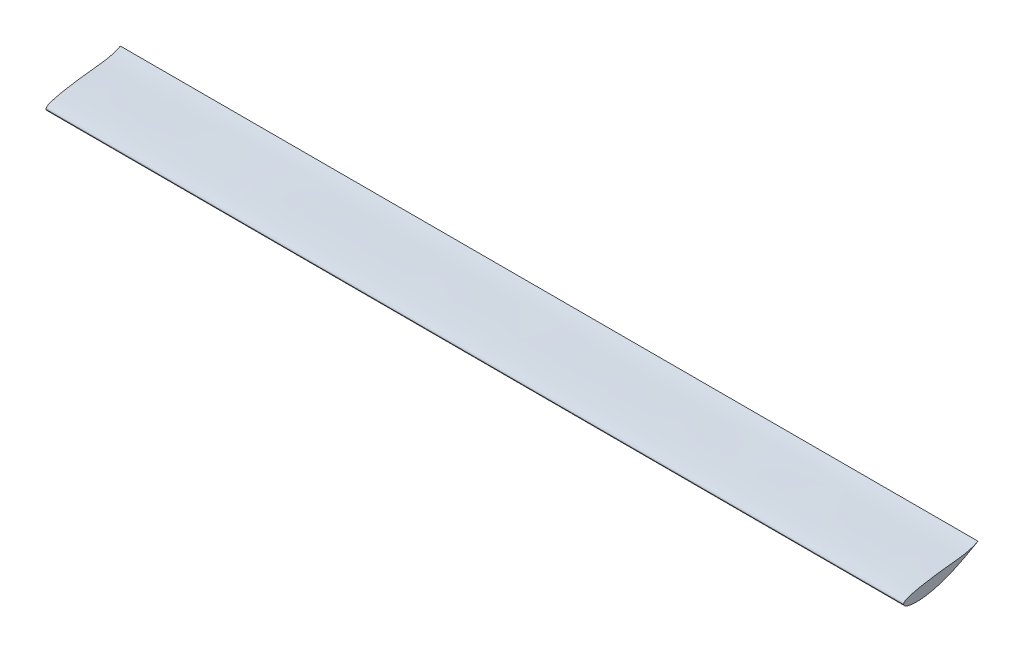
ISO-10303-21;
HEADER;
FILE_DESCRIPTION(('STEP AP214'),'2;1');
FILE_NAME('part.step','',(''),(''),'','','');
FILE_SCHEMA(('AUTOMOTIVE_DESIGN { 1 0 10303 214 1 1 1 1 }'));
ENDSEC;
DATA;
#1=APPLICATION_CONTEXT('core data for automotive mechanical design processes');
#2=APPLICATION_PROTOCOL_DEFINITION('international standard','automotive_design',2000,#1);
#3=PRODUCT_CONTEXT('',#1,'mechanical');
#4=PRODUCT('Part','Part','',(#3));
#5=PRODUCT_RELATED_PRODUCT_CATEGORY('part','',(#4));
#6=PRODUCT_DEFINITION_FORMATION('','',#4);
#7=PRODUCT_DEFINITION_CONTEXT('part definition',#1,'design');
#8=PRODUCT_DEFINITION('design','',#6,#7);
#9=PRODUCT_DEFINITION_SHAPE('','',#8);
#10=(LENGTH_UNIT() NAMED_UNIT(*) SI_UNIT(.MILLI.,.METRE.));
#11=(NAMED_UNIT(*) PLANE_ANGLE_UNIT() SI_UNIT($,.RADIAN.));
#12=(NAMED_UNIT(*) SI_UNIT($,.STERADIAN.) SOLID_ANGLE_UNIT());
#13=UNCERTAINTY_MEASURE_WITH_UNIT(LENGTH_MEASURE(1.E-05),#10,'distance_accuracy_value','');
#14=(GEOMETRIC_REPRESENTATION_CONTEXT(3) GLOBAL_UNCERTAINTY_ASSIGNED_CONTEXT((#13)) GLOBAL_UNIT_ASSIGNED_CONTEXT((#10,
#11,#12)) REPRESENTATION_CONTEXT('',''));
#15=CARTESIAN_POINT('',(0.,0.,0.));
#16=DIRECTION('',(0.,0.,1.));
#17=DIRECTION('',(1.,0.,0.));
#18=AXIS2_PLACEMENT_3D('',#15,#16,#17);
#19=CARTESIAN_POINT('',(997.019750859984,12.4852152858677,-54.9823903122289));
#20=DIRECTION('',(-1.,0.,0.));
#21=DIRECTION('',(0.,0.,1.));
#22=AXIS2_PLACEMENT_3D('',#19,#20,#21);
#23=PLANE('',#22);
#24=CARTESIAN_POINT('',(997.019750859984,11.9268190478152,-10.4315130887669));
#25=CARTESIAN_POINT('',(997.019750859984,10.5307338394074,-10.9579322147792));
#26=CARTESIAN_POINT('',(997.019750859984,9.24548443054793,-12.8740565051285));
#27=CARTESIAN_POINT('',(997.019750859984,8.20882793908812,-15.7758436959106));
#28=CARTESIAN_POINT('',(997.019750859984,7.66358451817288,-18.226405051551));
#29=CARTESIAN_POINT('',(997.019750859984,7.22457301816056,-21.3569103835022));
#30=CARTESIAN_POINT('',(997.019750859984,7.05757379867098,-25.2050058399718));
#31=CARTESIAN_POINT('',(997.019750859984,7.31676609404541,-31.2301436962287));
#32=CARTESIAN_POINT('',(997.019750859984,8.31465271352174,-38.6258596725614));
#33=CARTESIAN_POINT('',(997.019750859984,10.1911582683209,-47.3390895813314));
#34=CARTESIAN_POINT('',(997.019750859984,12.6677105683231,-55.9134271742416));
#35=CARTESIAN_POINT('',(997.019750859984,15.8217306491794,-64.3176852528418));
#36=CARTESIAN_POINT('',(997.019750859984,19.5057001064381,-72.5892101961977));
#37=CARTESIAN_POINT('',(997.019750859984,23.6429894181503,-80.7385293186242));
#38=CARTESIAN_POINT('',(997.019750859984,28.047960913361,-88.825477680895));
#39=CARTESIAN_POINT('',(997.019750859984,31.1248720264375,-94.1623755603246));
#40=CARTESIAN_POINT('',(997.019750859984,32.6242235223829,-96.860765238436));
#41=B_SPLINE_CURVE_WITH_KNOTS('',3,(#24,#25,#26,#27,#28,#29,#30,#31,#32,#33,#34,#35,#36,#37,#38,
#39,#40),.UNSPECIFIED.,.F.,.F.,(4,1,1,1,1,1,1,1,1,1,1,1,1,1,4),(0.,0.0439009675766793,
0.0724931974140234,0.0990463982397024,0.124643035702787,0.174283288293371,0.222881713336981,
0.31883035285832,0.41429919096017,0.509891636581509,0.60612378963281,0.703302686626897,
0.801511361886123,0.900533646948853,1.),.UNSPECIFIED.);
#42=CARTESIAN_POINT('',(997.019750859984,32.6242235223829,-96.860765238436));
#43=VERTEX_POINT('',#42);
#44=CARTESIAN_POINT('',(997.019750859984,11.9268190478152,-10.4315130887669));
#45=VERTEX_POINT('',#44);
#46=EDGE_CURVE('E90',#43,#45,#41,.F.);
#47=ORIENTED_EDGE('',*,*,#46,.F.);
#48=CARTESIAN_POINT('',(997.019750859984,32.6242235223829,-96.860765238436));
#49=CARTESIAN_POINT('',(997.019750859984,31.2114581633454,-94.2053856379407));
#50=CARTESIAN_POINT('',(997.019750859984,29.0114699837971,-88.6325644942649));
#51=CARTESIAN_POINT('',(997.019750859984,27.1158834792333,-79.8656280874714));
#52=CARTESIAN_POINT('',(997.019750859984,26.0393284874119,-71.0088770825528));
#53=CARTESIAN_POINT('',(997.019750859984,25.0904943034276,-62.1224001073808));
#54=CARTESIAN_POINT('',(997.019750859984,24.0154171059973,-53.2503231805116));
#55=CARTESIAN_POINT('',(997.019750859984,22.7915940653448,-44.4104065607168));
#56=CARTESIAN_POINT('',(997.019750859984,21.4557616261526,-35.6010494666442));
#57=CARTESIAN_POINT('',(997.019750859984,20.0615187892568,-28.3147230079671));
#58=CARTESIAN_POINT('',(997.019750859984,18.7379578321159,-22.5357609096181));
#59=CARTESIAN_POINT('',(997.019750859984,17.769530602484,-18.9558463728173));
#60=CARTESIAN_POINT('',(997.019750859984,16.8645361651102,-16.1206237663936));
#61=CARTESIAN_POINT('',(997.019750859984,16.0286010837289,-14.0142766694007));
#62=CARTESIAN_POINT('',(997.019750859984,14.7985784060911,-11.6273946587841));
#63=CARTESIAN_POINT('',(997.019750859984,13.3330792416217,-10.2164295195233));
#64=CARTESIAN_POINT('',(997.019750859984,11.9268190478152,-10.4315130887668));
#65=B_SPLINE_CURVE_WITH_KNOTS('',3,(#48,#49,#50,#51,#52,#53,#54,#55,#56,#57,#58,#59,#60,#61,#62,
#63,#64),.UNSPECIFIED.,.F.,.F.,(4,1,1,1,1,1,1,1,1,1,1,1,1,1,4),(0.,0.0994502667406111,
0.197535442889514,0.296052562977772,0.394806356808814,0.493450979662712,0.591940996969297,
0.690286731259081,0.788438582066012,0.837480949450307,0.886562535047494,0.911178481655704,
0.935996245563337,0.961487145328943,1.),.UNSPECIFIED.);
#66=EDGE_CURVE('E54',#45,#43,#65,.F.);
#67=ORIENTED_EDGE('',*,*,#66,.F.);
#68=EDGE_LOOP('',(#47,#67));
#69=FACE_BOUND('',#68,.T.);
#70=ADVANCED_FACE('F51',(#69),#23,.F.);
#71=CARTESIAN_POINT('',(0.,23.9130453140823,-52.6606146925307));
#72=DIRECTION('',(1.,0.,0.));
#73=DIRECTION('',(0.,0.,-1.));
#74=AXIS2_PLACEMENT_3D('',#71,#72,#73);
#75=PLANE('',#74);
#76=CARTESIAN_POINT('',(0.,32.6242235223829,-96.860765238436));
#77=CARTESIAN_POINT('',(0.,31.2114581633461,-94.205385637942));
#78=CARTESIAN_POINT('',(0.,29.0114699837977,-88.6325644942664));
#79=CARTESIAN_POINT('',(0.,27.1158834792337,-79.8656280874725));
#80=CARTESIAN_POINT('',(0.,26.0393284874124,-71.008877082554));
#81=CARTESIAN_POINT('',(0.,25.090494303428,-62.1224001073821));
#82=CARTESIAN_POINT('',(0.,24.0154171059978,-53.2503231805125));
#83=CARTESIAN_POINT('',(0.,22.7915940653452,-44.4104065607176));
#84=CARTESIAN_POINT('',(0.,21.455761626153,-35.6010494666448));
#85=CARTESIAN_POINT('',(0.,20.0615187892571,-28.3147230079676));
#86=CARTESIAN_POINT('',(0.,18.7379578321163,-22.5357609096185));
#87=CARTESIAN_POINT('',(0.,17.7695306024843,-18.9558463728176));
#88=CARTESIAN_POINT('',(0.,16.8645361651106,-16.120623766394));
#89=CARTESIAN_POINT('',(0.,16.0286010837293,-14.014276669401));
#90=CARTESIAN_POINT('',(0.,14.7985784060914,-11.6273946587844));
#91=CARTESIAN_POINT('',(0.,13.3330792416219,-10.2164295195236));
#92=CARTESIAN_POINT('',(0.,11.9268190478152,-10.4315130887668));
#93=B_SPLINE_CURVE_WITH_KNOTS('',3,(#76,#77,#78,#79,#80,#81,#82,#83,#84,#85,#86,#87,#88,#89,#90,
#91,#92),.UNSPECIFIED.,.F.,.F.,(4,1,1,1,1,1,1,1,1,1,1,1,1,1,4),(0.,0.0994502667406111,
0.197535442889514,0.296052562977772,0.394806356808814,0.493450979662712,0.591940996969297,
0.690286731259081,0.788438582066012,0.837480949450307,0.886562535047494,0.911178481655704,
0.935996245563337,0.961487145328943,1.),.UNSPECIFIED.);
#94=CARTESIAN_POINT('',(0.,32.6242235223829,-96.860765238436));
#95=VERTEX_POINT('',#94);
#96=CARTESIAN_POINT('',(0.,11.9268190478152,-10.4315130887668));
#97=VERTEX_POINT('',#96);
#98=EDGE_CURVE('E12',#95,#97,#93,.T.);
#99=ORIENTED_EDGE('',*,*,#98,.F.);
#100=CARTESIAN_POINT('',(0.,11.9268190478152,-10.4315130887668));
#101=CARTESIAN_POINT('',(0.,10.5307338394076,-10.9579322147794));
#102=CARTESIAN_POINT('',(0.,9.24548443054814,-12.8740565051289));
#103=CARTESIAN_POINT('',(0.,8.20882793908821,-15.775843695911));
#104=CARTESIAN_POINT('',(0.,7.66358451817309,-18.2264050515513));
#105=CARTESIAN_POINT('',(0.,7.22457301816072,-21.3569103835027));
#106=CARTESIAN_POINT('',(0.,7.0575737986711,-25.2050058399724));
#107=CARTESIAN_POINT('',(0.,7.31676609404554,-31.2301436962292));
#108=CARTESIAN_POINT('',(0.,8.31465271352197,-38.6258596725622));
#109=CARTESIAN_POINT('',(0.,10.1911582683211,-47.3390895813322));
#110=CARTESIAN_POINT('',(0.,12.6677105683233,-55.9134271742426));
#111=CARTESIAN_POINT('',(0.,15.8217306491797,-64.3176852528428));
#112=CARTESIAN_POINT('',(0.,19.5057001064384,-72.5892101961988));
#113=CARTESIAN_POINT('',(0.,23.6429894181506,-80.7385293186258));
#114=CARTESIAN_POINT('',(0.,28.0479609133615,-88.8254776808962));
#115=CARTESIAN_POINT('',(0.,31.1248720264378,-94.1623755603261));
#116=CARTESIAN_POINT('',(0.,32.6242235223829,-96.860765238436));
#117=B_SPLINE_CURVE_WITH_KNOTS('',3,(#100,#101,#102,#103,#104,#105,#106,#107,#108,#109,#110,
#111,#112,#113,#114,#115,#116),.UNSPECIFIED.,.F.,.F.,(4,1,1,1,1,1,1,1,1,1,1,1,1,1,4),(0.,
0.0439009675766793,0.0724931974140234,0.0990463982397024,0.124643035702787,0.174283288293371,
0.222881713336981,0.31883035285832,0.41429919096017,0.509891636581509,0.60612378963281,
0.703302686626897,0.801511361886123,0.900533646948853,1.),.UNSPECIFIED.);
#118=EDGE_CURVE('E76',#97,#95,#117,.T.);
#119=ORIENTED_EDGE('',*,*,#118,.F.);
#120=EDGE_LOOP('',(#99,#119));
#121=FACE_BOUND('',#120,.T.);
#122=ADVANCED_FACE('F77',(#121),#75,.F.);
#123=CARTESIAN_POINT('',(0.,32.6242235223829,-96.860765238436));
#124=CARTESIAN_POINT('',(332.339916953328,32.6242235223829,-96.860765238436));
#125=CARTESIAN_POINT('',(664.679833906656,32.6242235223829,-96.860765238436));
#126=CARTESIAN_POINT('',(997.019750859984,32.6242235223829,-96.860765238436));
#127=CARTESIAN_POINT('',(0.,31.2114581633461,-94.205385637942));
#128=CARTESIAN_POINT('',(332.339916953328,31.2114581633459,-94.2053856379415));
#129=CARTESIAN_POINT('',(664.679833906656,31.2114581633456,-94.2053856379411));
#130=CARTESIAN_POINT('',(997.019750859984,31.2114581633454,-94.2053856379407));
#131=CARTESIAN_POINT('',(0.,29.0114699837977,-88.6325644942664));
#132=CARTESIAN_POINT('',(332.339916953328,29.0114699837975,-88.6325644942659));
#133=CARTESIAN_POINT('',(664.679833906656,29.0114699837973,-88.6325644942654));
#134=CARTESIAN_POINT('',(997.019750859984,29.0114699837971,-88.6325644942649));
#135=CARTESIAN_POINT('',(0.,27.1158834792337,-79.8656280874725));
#136=CARTESIAN_POINT('',(332.339916953328,27.1158834792336,-79.8656280874721));
#137=CARTESIAN_POINT('',(664.679833906656,27.1158834792334,-79.8656280874717));
#138=CARTESIAN_POINT('',(997.019750859984,27.1158834792333,-79.8656280874714));
#139=CARTESIAN_POINT('',(0.,26.0393284874124,-71.008877082554));
#140=CARTESIAN_POINT('',(332.339916953328,26.0393284874122,-71.0088770825536));
#141=CARTESIAN_POINT('',(664.679833906656,26.0393284874121,-71.0088770825532));
#142=CARTESIAN_POINT('',(997.019750859984,26.0393284874119,-71.0088770825528));
#143=CARTESIAN_POINT('',(0.,25.090494303428,-62.1224001073821));
#144=CARTESIAN_POINT('',(332.339916953328,25.0904943034279,-62.1224001073816));
#145=CARTESIAN_POINT('',(664.679833906656,25.0904943034278,-62.1224001073812));
#146=CARTESIAN_POINT('',(997.019750859984,25.0904943034276,-62.1224001073808));
#147=CARTESIAN_POINT('',(0.,24.0154171059978,-53.2503231805125));
#148=CARTESIAN_POINT('',(332.339916953328,24.0154171059976,-53.2503231805122));
#149=CARTESIAN_POINT('',(664.679833906656,24.0154171059975,-53.2503231805119));
#150=CARTESIAN_POINT('',(997.019750859984,24.0154171059973,-53.2503231805116));
#151=CARTESIAN_POINT('',(0.,22.7915940653452,-44.4104065607176));
#152=CARTESIAN_POINT('',(332.339916953328,22.7915940653451,-44.4104065607173));
#153=CARTESIAN_POINT('',(664.679833906656,22.7915940653449,-44.410406560717));
#154=CARTESIAN_POINT('',(997.019750859984,22.7915940653448,-44.4104065607168));
#155=CARTESIAN_POINT('',(0.,21.455761626153,-35.6010494666448));
#156=CARTESIAN_POINT('',(332.339916953328,21.4557616261529,-35.6010494666446));
#157=CARTESIAN_POINT('',(664.679833906656,21.4557616261527,-35.6010494666444));
#158=CARTESIAN_POINT('',(997.019750859984,21.4557616261526,-35.6010494666442));
#159=CARTESIAN_POINT('',(0.,20.0615187892571,-28.3147230079676));
#160=CARTESIAN_POINT('',(332.339916953328,20.061518789257,-28.3147230079674));
#161=CARTESIAN_POINT('',(664.679833906656,20.0615187892569,-28.3147230079673));
#162=CARTESIAN_POINT('',(997.019750859984,20.0615187892568,-28.3147230079671));
#163=CARTESIAN_POINT('',(0.,18.7379578321163,-22.5357609096185));
#164=CARTESIAN_POINT('',(332.339916953328,18.7379578321162,-22.5357609096184));
#165=CARTESIAN_POINT('',(664.679833906656,18.7379578321161,-22.5357609096182));
#166=CARTESIAN_POINT('',(997.019750859984,18.7379578321159,-22.5357609096181));
#167=CARTESIAN_POINT('',(0.,17.7695306024843,-18.9558463728176));
#168=CARTESIAN_POINT('',(332.339916953328,17.7695306024842,-18.9558463728175));
#169=CARTESIAN_POINT('',(664.679833906656,17.7695306024841,-18.9558463728174));
#170=CARTESIAN_POINT('',(997.019750859984,17.769530602484,-18.9558463728173));
#171=CARTESIAN_POINT('',(0.,16.8645361651106,-16.120623766394));
#172=CARTESIAN_POINT('',(332.339916953328,16.8645361651105,-16.1206237663939));
#173=CARTESIAN_POINT('',(664.679833906656,16.8645361651104,-16.1206237663937));
#174=CARTESIAN_POINT('',(997.019750859984,16.8645361651102,-16.1206237663936));
#175=CARTESIAN_POINT('',(0.,16.0286010837293,-14.014276669401));
#176=CARTESIAN_POINT('',(332.339916953328,16.0286010837291,-14.0142766694009));
#177=CARTESIAN_POINT('',(664.679833906656,16.028601083729,-14.0142766694008));
#178=CARTESIAN_POINT('',(997.019750859984,16.0286010837289,-14.0142766694007));
#179=CARTESIAN_POINT('',(0.,14.7985784060914,-11.6273946587844));
#180=CARTESIAN_POINT('',(332.339916953328,14.7985784060913,-11.6273946587843));
#181=CARTESIAN_POINT('',(664.679833906656,14.7985784060912,-11.6273946587842));
#182=CARTESIAN_POINT('',(997.019750859984,14.7985784060911,-11.6273946587841));
#183=CARTESIAN_POINT('',(0.,13.3330792416219,-10.2164295195236));
#184=CARTESIAN_POINT('',(332.339916953328,13.3330792416218,-10.2164295195235));
#185=CARTESIAN_POINT('',(664.679833906656,13.3330792416218,-10.2164295195234));
#186=CARTESIAN_POINT('',(997.019750859984,13.3330792416217,-10.2164295195233));
#187=CARTESIAN_POINT('',(0.,11.9268190478152,-10.4315130887668));
#188=CARTESIAN_POINT('',(332.339916953328,11.9268190478152,-10.4315130887668));
#189=CARTESIAN_POINT('',(664.679833906656,11.9268190478152,-10.4315130887668));
#190=CARTESIAN_POINT('',(997.019750859984,11.9268190478152,-10.4315130887668));
#191=B_SPLINE_SURFACE_WITH_KNOTS('',3,3,((#123,#124,#125,#126),(#127,#128,#129,#130),(#131,#132,
#133,#134),(#135,#136,#137,#138),(#139,#140,#141,#142),(#143,#144,#145,#146),(#147,#148,#149,
#150),(#151,#152,#153,#154),(#155,#156,#157,#158),(#159,#160,#161,#162),(#163,#164,#165,#166),
(#167,#168,#169,#170),(#171,#172,#173,#174),(#175,#176,#177,#178),(#179,#180,#181,#182),(#183,
#184,#185,#186),(#187,#188,#189,#190)),.UNSPECIFIED.,.F.,.F.,.F.,(4,1,1,1,1,1,1,1,1,1,1,1,1,1,
4),(4,4),(0.,0.0994502667406111,0.197535442889514,0.296052562977772,0.394806356808814,
0.493450979662712,0.591940996969297,0.690286731259081,0.788438582066012,0.837480949450307,
0.886562535047494,0.911178481655704,0.935996245563337,0.961487145328943,1.),(0.,1.),.UNSPECIFIED.);
#192=DIRECTION('',(-1.,0.,0.));
#193=VECTOR('',#192,1.);
#194=CARTESIAN_POINT('',(498.509875429992,11.9268190478152,-10.4315130887668));
#195=LINE('',#194,#193);
#196=EDGE_CURVE('E88',#45,#97,#195,.T.);
#197=DIRECTION('',(1.,0.,0.));
#198=VECTOR('',#197,1.);
#199=CARTESIAN_POINT('',(498.509875429992,32.6242235223829,-96.860765238436));
#200=LINE('',#199,#198);
#201=EDGE_CURVE('E83',#95,#43,#200,.T.);
#202=ORIENTED_EDGE('',*,*,#98,.T.);
#203=ORIENTED_EDGE('',*,*,#196,.F.);
#204=ORIENTED_EDGE('',*,*,#66,.T.);
#205=ORIENTED_EDGE('',*,*,#201,.F.);
#206=EDGE_LOOP('',(#202,#203,#204,#205));
#207=FACE_BOUND('',#206,.T.);
#208=ADVANCED_FACE('F87',(#207),#191,.T.);
#209=CARTESIAN_POINT('',(0.,11.9268190478152,-10.4315130887668));
#210=CARTESIAN_POINT('',(332.339916953328,11.9268190478152,-10.4315130887668));
#211=CARTESIAN_POINT('',(664.679833906656,11.9268190478152,-10.4315130887668));
#212=CARTESIAN_POINT('',(997.019750859984,11.9268190478152,-10.4315130887669));
#213=CARTESIAN_POINT('',(0.,10.5307338394076,-10.9579322147794));
#214=CARTESIAN_POINT('',(332.339916953328,10.5307338394075,-10.9579322147793));
#215=CARTESIAN_POINT('',(664.679833906656,10.5307338394075,-10.9579322147793));
#216=CARTESIAN_POINT('',(997.019750859984,10.5307338394074,-10.9579322147792));
#217=CARTESIAN_POINT('',(0.,9.24548443054814,-12.8740565051289));
#218=CARTESIAN_POINT('',(332.339916953328,9.24548443054807,-12.8740565051288));
#219=CARTESIAN_POINT('',(664.679833906656,9.245484430548,-12.8740565051286));
#220=CARTESIAN_POINT('',(997.019750859984,9.24548443054793,-12.8740565051285));
#221=CARTESIAN_POINT('',(0.,8.20882793908821,-15.775843695911));
#222=CARTESIAN_POINT('',(332.339916953328,8.20882793908818,-15.7758436959108));
#223=CARTESIAN_POINT('',(664.679833906656,8.20882793908815,-15.7758436959107));
#224=CARTESIAN_POINT('',(997.019750859984,8.20882793908812,-15.7758436959106));
#225=CARTESIAN_POINT('',(0.,7.66358451817309,-18.2264050515513));
#226=CARTESIAN_POINT('',(332.339916953328,7.66358451817302,-18.2264050515512));
#227=CARTESIAN_POINT('',(664.679833906656,7.66358451817295,-18.2264050515511));
#228=CARTESIAN_POINT('',(997.019750859984,7.66358451817288,-18.226405051551));
#229=CARTESIAN_POINT('',(0.,7.22457301816072,-21.3569103835027));
#230=CARTESIAN_POINT('',(332.339916953328,7.22457301816067,-21.3569103835026));
#231=CARTESIAN_POINT('',(664.679833906656,7.22457301816061,-21.3569103835024));
#232=CARTESIAN_POINT('',(997.019750859984,7.22457301816056,-21.3569103835022));
#233=CARTESIAN_POINT('',(0.,7.0575737986711,-25.2050058399724));
#234=CARTESIAN_POINT('',(332.339916953328,7.05757379867106,-25.2050058399722));
#235=CARTESIAN_POINT('',(664.679833906656,7.05757379867102,-25.205005839972));
#236=CARTESIAN_POINT('',(997.019750859984,7.05757379867098,-25.2050058399718));
#237=CARTESIAN_POINT('',(0.,7.31676609404554,-31.2301436962292));
#238=CARTESIAN_POINT('',(332.339916953328,7.3167660940455,-31.230143696229));
#239=CARTESIAN_POINT('',(664.679833906656,7.31676609404545,-31.2301436962289));
#240=CARTESIAN_POINT('',(997.019750859984,7.31676609404541,-31.2301436962287));
#241=CARTESIAN_POINT('',(0.,8.31465271352197,-38.6258596725622));
#242=CARTESIAN_POINT('',(332.339916953328,8.31465271352189,-38.6258596725619));
#243=CARTESIAN_POINT('',(664.679833906656,8.31465271352182,-38.6258596725617));
#244=CARTESIAN_POINT('',(997.019750859984,8.31465271352174,-38.6258596725614));
#245=CARTESIAN_POINT('',(0.,10.1911582683211,-47.3390895813322));
#246=CARTESIAN_POINT('',(332.339916953328,10.191158268321,-47.3390895813319));
#247=CARTESIAN_POINT('',(664.679833906656,10.191158268321,-47.3390895813316));
#248=CARTESIAN_POINT('',(997.019750859984,10.1911582683209,-47.3390895813314));
#249=CARTESIAN_POINT('',(0.,12.6677105683233,-55.9134271742426));
#250=CARTESIAN_POINT('',(332.339916953328,12.6677105683232,-55.9134271742422));
#251=CARTESIAN_POINT('',(664.679833906656,12.6677105683232,-55.9134271742419));
#252=CARTESIAN_POINT('',(997.019750859984,12.6677105683231,-55.9134271742416));
#253=CARTESIAN_POINT('',(0.,15.8217306491797,-64.3176852528428));
#254=CARTESIAN_POINT('',(332.339916953328,15.8217306491796,-64.3176852528425));
#255=CARTESIAN_POINT('',(664.679833906656,15.8217306491795,-64.3176852528421));
#256=CARTESIAN_POINT('',(997.019750859984,15.8217306491794,-64.3176852528418));
#257=CARTESIAN_POINT('',(0.,19.5057001064384,-72.5892101961988));
#258=CARTESIAN_POINT('',(332.339916953328,19.5057001064383,-72.5892101961985));
#259=CARTESIAN_POINT('',(664.679833906656,19.5057001064382,-72.5892101961981));
#260=CARTESIAN_POINT('',(997.019750859984,19.5057001064381,-72.5892101961977));
#261=CARTESIAN_POINT('',(0.,23.6429894181506,-80.7385293186258));
#262=CARTESIAN_POINT('',(332.339916953328,23.6429894181505,-80.7385293186253));
#263=CARTESIAN_POINT('',(664.679833906656,23.6429894181504,-80.7385293186247));
#264=CARTESIAN_POINT('',(997.019750859984,23.6429894181503,-80.7385293186242));
#265=CARTESIAN_POINT('',(0.,28.0479609133615,-88.8254776808962));
#266=CARTESIAN_POINT('',(332.339916953328,28.0479609133614,-88.8254776808958));
#267=CARTESIAN_POINT('',(664.679833906656,28.0479609133612,-88.8254776808954));
#268=CARTESIAN_POINT('',(997.019750859984,28.047960913361,-88.825477680895));
#269=CARTESIAN_POINT('',(0.,31.1248720264378,-94.1623755603261));
#270=CARTESIAN_POINT('',(332.339916953328,31.1248720264377,-94.1623755603256));
#271=CARTESIAN_POINT('',(664.679833906656,31.1248720264376,-94.1623755603251));
#272=CARTESIAN_POINT('',(997.019750859984,31.1248720264375,-94.1623755603246));
#273=CARTESIAN_POINT('',(0.,32.6242235223829,-96.860765238436));
#274=CARTESIAN_POINT('',(332.339916953328,32.6242235223829,-96.860765238436));
#275=CARTESIAN_POINT('',(664.679833906656,32.6242235223829,-96.860765238436));
#276=CARTESIAN_POINT('',(997.019750859984,32.6242235223829,-96.860765238436));
#277=B_SPLINE_SURFACE_WITH_KNOTS('',3,3,((#209,#210,#211,#212),(#213,#214,#215,#216),(#217,#218,
#219,#220),(#221,#222,#223,#224),(#225,#226,#227,#228),(#229,#230,#231,#232),(#233,#234,#235,
#236),(#237,#238,#239,#240),(#241,#242,#243,#244),(#245,#246,#247,#248),(#249,#250,#251,#252),
(#253,#254,#255,#256),(#257,#258,#259,#260),(#261,#262,#263,#264),(#265,#266,#267,#268),(#269,
#270,#271,#272),(#273,#274,#275,#276)),.UNSPECIFIED.,.F.,.F.,.F.,(4,1,1,1,1,1,1,1,1,1,1,1,1,1,
4),(4,4),(0.,0.0439009675766793,0.0724931974140234,0.0990463982397024,0.124643035702787,
0.174283288293371,0.222881713336981,0.31883035285832,0.41429919096017,0.509891636581509,
0.60612378963281,0.703302686626897,0.801511361886123,0.900533646948853,1.),(0.,1.),.UNSPECIFIED.);
#278=ORIENTED_EDGE('',*,*,#118,.T.);
#279=ORIENTED_EDGE('',*,*,#201,.T.);
#280=ORIENTED_EDGE('',*,*,#46,.T.);
#281=ORIENTED_EDGE('',*,*,#196,.T.);
#282=EDGE_LOOP('',(#278,#279,#280,#281));
#283=FACE_BOUND('',#282,.T.);
#284=ADVANCED_FACE('F89',(#283),#277,.T.);
#285=CLOSED_SHELL('',(#70,#122,#208,#284));
#286=MANIFOLD_SOLID_BREP('B2',#285);
#287=ADVANCED_BREP_SHAPE_REPRESENTATION('',(#18,#286),#14);
#288=SHAPE_DEFINITION_REPRESENTATION(#9,#287);
ENDSEC;
END-ISO-10303-21;
